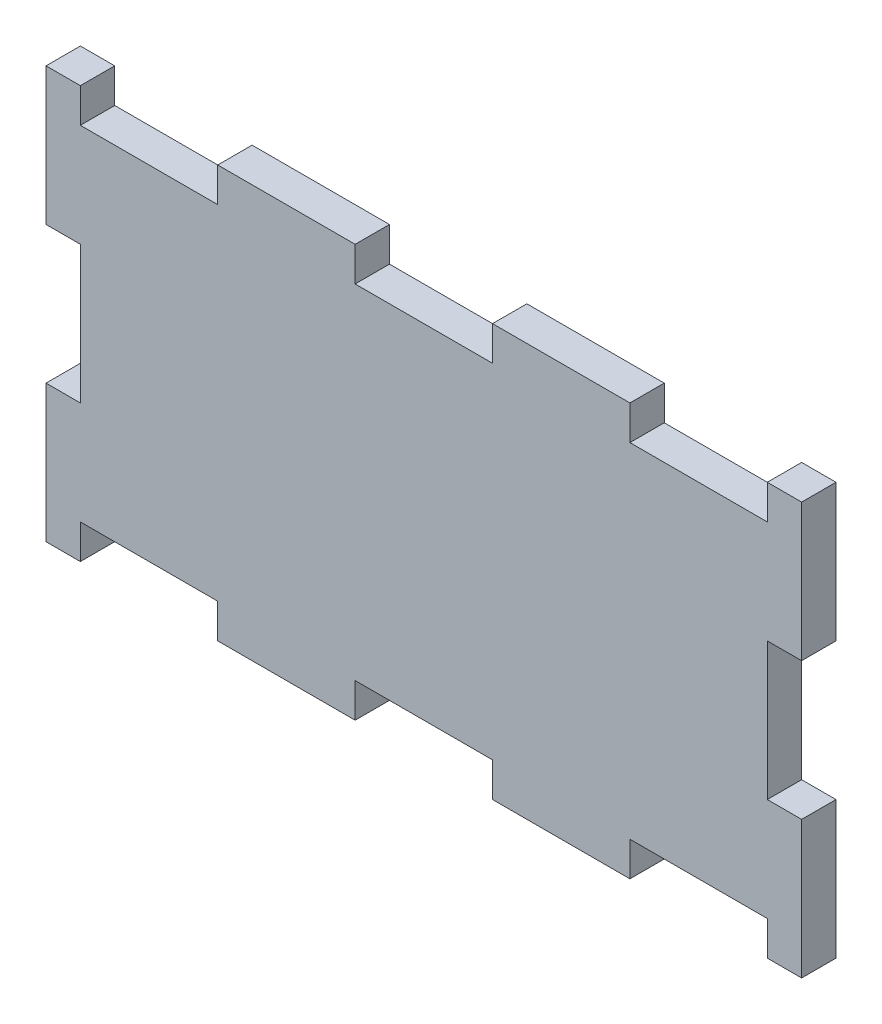
ISO-10303-21;
HEADER;
FILE_DESCRIPTION(('STEP AP214'),'2;1');
FILE_NAME('part.step','',(''),(''),'','','');
FILE_SCHEMA(('AUTOMOTIVE_DESIGN { 1 0 10303 214 1 1 1 1 }'));
ENDSEC;
DATA;
#1=APPLICATION_CONTEXT('core data for automotive mechanical design processes');
#2=APPLICATION_PROTOCOL_DEFINITION('international standard','automotive_design',2000,#1);
#3=PRODUCT_CONTEXT('',#1,'mechanical');
#4=PRODUCT('Part','Part','',(#3));
#5=PRODUCT_RELATED_PRODUCT_CATEGORY('part','',(#4));
#6=PRODUCT_DEFINITION_FORMATION('','',#4);
#7=PRODUCT_DEFINITION_CONTEXT('part definition',#1,'design');
#8=PRODUCT_DEFINITION('design','',#6,#7);
#9=PRODUCT_DEFINITION_SHAPE('','',#8);
#10=(LENGTH_UNIT() NAMED_UNIT(*) SI_UNIT(.MILLI.,.METRE.));
#11=(NAMED_UNIT(*) PLANE_ANGLE_UNIT() SI_UNIT($,.RADIAN.));
#12=(NAMED_UNIT(*) SI_UNIT($,.STERADIAN.) SOLID_ANGLE_UNIT());
#13=UNCERTAINTY_MEASURE_WITH_UNIT(LENGTH_MEASURE(1.E-05),#10,'distance_accuracy_value','');
#14=(GEOMETRIC_REPRESENTATION_CONTEXT(3) GLOBAL_UNCERTAINTY_ASSIGNED_CONTEXT((#13)) GLOBAL_UNIT_ASSIGNED_CONTEXT((#10,
#11,#12)) REPRESENTATION_CONTEXT('',''));
#15=CARTESIAN_POINT('',(0.,0.,0.));
#16=DIRECTION('',(0.,0.,1.));
#17=DIRECTION('',(1.,0.,0.));
#18=AXIS2_PLACEMENT_3D('',#15,#16,#17);
#19=CARTESIAN_POINT('',(-50.,25.,5.));
#20=DIRECTION('',(1.,0.,0.));
#21=DIRECTION('',(0.,0.,-1.));
#22=AXIS2_PLACEMENT_3D('',#19,#20,#21);
#23=PLANE('',#22);
#24=DIRECTION('',(0.,0.,1.));
#25=VECTOR('',#24,1.);
#26=CARTESIAN_POINT('',(-50.,10.,-20.6155281280883));
#27=LINE('',#26,#25);
#28=CARTESIAN_POINT('',(-50.,10.,0.));
#29=VERTEX_POINT('',#28);
#30=CARTESIAN_POINT('',(-50.,10.,5.));
#31=VERTEX_POINT('',#30);
#32=EDGE_CURVE('E348',#29,#31,#27,.T.);
#33=ORIENTED_EDGE('',*,*,#32,.F.);
#34=DIRECTION('',(0.,-1.,0.));
#35=VECTOR('',#34,1.);
#36=CARTESIAN_POINT('',(-50.,25.,0.));
#37=LINE('',#36,#35);
#38=CARTESIAN_POINT('',(-50.,-10.,0.));
#39=VERTEX_POINT('',#38);
#40=EDGE_CURVE('E615',#29,#39,#37,.T.);
#41=ORIENTED_EDGE('',*,*,#40,.T.);
#42=DIRECTION('',(0.,0.,1.));
#43=VECTOR('',#42,1.);
#44=CARTESIAN_POINT('',(-50.,-10.,-20.6155281280883));
#45=LINE('',#44,#43);
#46=CARTESIAN_POINT('',(-50.,-10.,5.));
#47=VERTEX_POINT('',#46);
#48=EDGE_CURVE('E534',#39,#47,#45,.T.);
#49=ORIENTED_EDGE('',*,*,#48,.T.);
#50=DIRECTION('',(0.,-1.,0.));
#51=VECTOR('',#50,1.);
#52=CARTESIAN_POINT('',(-50.,25.,5.));
#53=LINE('',#52,#51);
#54=EDGE_CURVE('E599',#31,#47,#53,.T.);
#55=ORIENTED_EDGE('',*,*,#54,.F.);
#56=EDGE_LOOP('',(#33,#41,#49,#55));
#57=FACE_BOUND('',#56,.T.);
#58=ADVANCED_FACE('F39',(#57),#23,.F.);
#59=CARTESIAN_POINT('',(-50.,-25.,5.));
#60=DIRECTION('',(0.,1.,0.));
#61=DIRECTION('',(0.,0.,1.));
#62=AXIS2_PLACEMENT_3D('',#59,#60,#61);
#63=PLANE('',#62);
#64=DIRECTION('',(0.,0.,1.));
#65=VECTOR('',#64,1.);
#66=CARTESIAN_POINT('',(30.,-25.,-20.6155281280883));
#67=LINE('',#66,#65);
#68=CARTESIAN_POINT('',(30.,-25.,0.));
#69=VERTEX_POINT('',#68);
#70=CARTESIAN_POINT('',(30.,-25.,5.));
#71=VERTEX_POINT('',#70);
#72=EDGE_CURVE('E388',#69,#71,#67,.T.);
#73=ORIENTED_EDGE('',*,*,#72,.F.);
#74=DIRECTION('',(1.,0.,0.));
#75=VECTOR('',#74,1.);
#76=CARTESIAN_POINT('',(-50.,-25.,0.));
#77=LINE('',#76,#75);
#78=CARTESIAN_POINT('',(50.,-25.,0.));
#79=VERTEX_POINT('',#78);
#80=EDGE_CURVE('E619',#69,#79,#77,.T.);
#81=ORIENTED_EDGE('',*,*,#80,.T.);
#82=DIRECTION('',(0.,0.,-1.));
#83=VECTOR('',#82,1.);
#84=CARTESIAN_POINT('',(50.,-25.,5.));
#85=LINE('',#84,#83);
#86=CARTESIAN_POINT('',(50.,-25.,5.));
#87=VERTEX_POINT('',#86);
#88=EDGE_CURVE('E607',#87,#79,#85,.T.);
#89=ORIENTED_EDGE('',*,*,#88,.F.);
#90=DIRECTION('',(1.,0.,0.));
#91=VECTOR('',#90,1.);
#92=CARTESIAN_POINT('',(-50.,-25.,5.));
#93=LINE('',#92,#91);
#94=EDGE_CURVE('E603',#71,#87,#93,.T.);
#95=ORIENTED_EDGE('',*,*,#94,.F.);
#96=EDGE_LOOP('',(#73,#81,#89,#95));
#97=FACE_BOUND('',#96,.T.);
#98=ADVANCED_FACE('F724',(#97),#63,.F.);
#99=DIRECTION('',(0.,0.,1.));
#100=VECTOR('',#99,1.);
#101=CARTESIAN_POINT('',(10.,-25.,-20.6155281280883));
#102=LINE('',#101,#100);
#103=CARTESIAN_POINT('',(10.,-25.,0.));
#104=VERTEX_POINT('',#103);
#105=CARTESIAN_POINT('',(10.,-25.,5.));
#106=VERTEX_POINT('',#105);
#107=EDGE_CURVE('E385',#104,#106,#102,.T.);
#108=ORIENTED_EDGE('',*,*,#107,.T.);
#109=CARTESIAN_POINT('',(-10.,-25.,5.));
#110=VERTEX_POINT('',#109);
#111=EDGE_CURVE('E608',#110,#106,#93,.T.);
#112=ORIENTED_EDGE('',*,*,#111,.F.);
#113=DIRECTION('',(0.,0.,1.));
#114=VECTOR('',#113,1.);
#115=CARTESIAN_POINT('',(-10.,-25.,-20.6155281280883));
#116=LINE('',#115,#114);
#117=CARTESIAN_POINT('',(-10.,-25.,0.));
#118=VERTEX_POINT('',#117);
#119=EDGE_CURVE('E423',#118,#110,#116,.T.);
#120=ORIENTED_EDGE('',*,*,#119,.F.);
#121=EDGE_CURVE('E622',#118,#104,#77,.T.);
#122=ORIENTED_EDGE('',*,*,#121,.T.);
#123=EDGE_LOOP('',(#108,#112,#120,#122));
#124=FACE_BOUND('',#123,.T.);
#125=ADVANCED_FACE('F730',(#124),#63,.F.);
#126=CARTESIAN_POINT('',(-50.,25.,5.));
#127=DIRECTION('',(0.,-1.,0.));
#128=DIRECTION('',(0.,0.,-1.));
#129=AXIS2_PLACEMENT_3D('',#126,#127,#128);
#130=PLANE('',#129);
#131=DIRECTION('',(0.,0.,1.));
#132=VECTOR('',#131,1.);
#133=CARTESIAN_POINT('',(-30.,25.,-20.6155281280883));
#134=LINE('',#133,#132);
#135=CARTESIAN_POINT('',(-30.,25.,0.));
#136=VERTEX_POINT('',#135);
#137=CARTESIAN_POINT('',(-30.,25.,5.));
#138=VERTEX_POINT('',#137);
#139=EDGE_CURVE('E460',#136,#138,#134,.T.);
#140=ORIENTED_EDGE('',*,*,#139,.F.);
#141=DIRECTION('',(-1.,0.,0.));
#142=VECTOR('',#141,1.);
#143=CARTESIAN_POINT('',(-50.,25.,0.));
#144=LINE('',#143,#142);
#145=CARTESIAN_POINT('',(-50.,25.,0.));
#146=VERTEX_POINT('',#145);
#147=EDGE_CURVE('E611',#136,#146,#144,.T.);
#148=ORIENTED_EDGE('',*,*,#147,.T.);
#149=DIRECTION('',(0.,0.,-1.));
#150=VECTOR('',#149,1.);
#151=CARTESIAN_POINT('',(-50.,25.,5.));
#152=LINE('',#151,#150);
#153=CARTESIAN_POINT('',(-50.,25.,5.));
#154=VERTEX_POINT('',#153);
#155=EDGE_CURVE('E48',#154,#146,#152,.T.);
#156=ORIENTED_EDGE('',*,*,#155,.F.);
#157=DIRECTION('',(-1.,0.,0.));
#158=VECTOR('',#157,1.);
#159=CARTESIAN_POINT('',(-50.,25.,5.));
#160=LINE('',#159,#158);
#161=EDGE_CURVE('E593',#138,#154,#160,.T.);
#162=ORIENTED_EDGE('',*,*,#161,.F.);
#163=EDGE_LOOP('',(#140,#148,#156,#162));
#164=FACE_BOUND('',#163,.T.);
#165=ADVANCED_FACE('F665',(#164),#130,.F.);
#166=DIRECTION('',(0.,0.,1.));
#167=VECTOR('',#166,1.);
#168=CARTESIAN_POINT('',(-10.,25.,-20.6155281280883));
#169=LINE('',#168,#167);
#170=CARTESIAN_POINT('',(-10.,25.,0.));
#171=VERTEX_POINT('',#170);
#172=CARTESIAN_POINT('',(-10.,25.,5.));
#173=VERTEX_POINT('',#172);
#174=EDGE_CURVE('E457',#171,#173,#169,.T.);
#175=ORIENTED_EDGE('',*,*,#174,.T.);
#176=CARTESIAN_POINT('',(10.,25.,5.));
#177=VERTEX_POINT('',#176);
#178=EDGE_CURVE('E600',#177,#173,#160,.T.);
#179=ORIENTED_EDGE('',*,*,#178,.F.);
#180=DIRECTION('',(0.,0.,1.));
#181=VECTOR('',#180,1.);
#182=CARTESIAN_POINT('',(10.,25.,-20.6155281280883));
#183=LINE('',#182,#181);
#184=CARTESIAN_POINT('',(10.,25.,0.));
#185=VERTEX_POINT('',#184);
#186=EDGE_CURVE('E495',#185,#177,#183,.T.);
#187=ORIENTED_EDGE('',*,*,#186,.F.);
#188=EDGE_CURVE('E616',#185,#171,#144,.T.);
#189=ORIENTED_EDGE('',*,*,#188,.T.);
#190=EDGE_LOOP('',(#175,#179,#187,#189));
#191=FACE_BOUND('',#190,.T.);
#192=ADVANCED_FACE('F669',(#191),#130,.F.);
#193=CARTESIAN_POINT('',(50.,25.,5.));
#194=DIRECTION('',(-1.,0.,0.));
#195=DIRECTION('',(0.,0.,1.));
#196=AXIS2_PLACEMENT_3D('',#193,#194,#195);
#197=PLANE('',#196);
#198=DIRECTION('',(0.,1.,0.));
#199=VECTOR('',#198,1.);
#200=CARTESIAN_POINT('',(50.,25.,0.));
#201=LINE('',#200,#199);
#202=CARTESIAN_POINT('',(50.,-10.,0.));
#203=VERTEX_POINT('',#202);
#204=CARTESIAN_POINT('',(50.,10.,0.));
#205=VERTEX_POINT('',#204);
#206=EDGE_CURVE('E60',#203,#205,#201,.T.);
#207=ORIENTED_EDGE('',*,*,#206,.T.);
#208=DIRECTION('',(0.,0.,1.));
#209=VECTOR('',#208,1.);
#210=CARTESIAN_POINT('',(50.,10.,-20.6155281280883));
#211=LINE('',#210,#209);
#212=CARTESIAN_POINT('',(50.,10.,5.));
#213=VERTEX_POINT('',#212);
#214=EDGE_CURVE('E55',#205,#213,#211,.T.);
#215=ORIENTED_EDGE('',*,*,#214,.T.);
#216=DIRECTION('',(0.,1.,0.));
#217=VECTOR('',#216,1.);
#218=CARTESIAN_POINT('',(50.,25.,5.));
#219=LINE('',#218,#217);
#220=CARTESIAN_POINT('',(50.,-10.,5.));
#221=VERTEX_POINT('',#220);
#222=EDGE_CURVE('E296',#221,#213,#219,.T.);
#223=ORIENTED_EDGE('',*,*,#222,.F.);
#224=DIRECTION('',(0.,0.,1.));
#225=VECTOR('',#224,1.);
#226=CARTESIAN_POINT('',(50.,-10.,-20.6155281280883));
#227=LINE('',#226,#225);
#228=EDGE_CURVE('E555',#203,#221,#227,.T.);
#229=ORIENTED_EDGE('',*,*,#228,.F.);
#230=EDGE_LOOP('',(#207,#215,#223,#229));
#231=FACE_BOUND('',#230,.T.);
#232=ADVANCED_FACE('F41',(#231),#197,.F.);
#233=CARTESIAN_POINT('',(50.,25.,0.));
#234=VERTEX_POINT('',#233);
#235=CARTESIAN_POINT('',(30.,25.,0.));
#236=VERTEX_POINT('',#235);
#237=EDGE_CURVE('E612',#234,#236,#144,.T.);
#238=ORIENTED_EDGE('',*,*,#237,.T.);
#239=DIRECTION('',(0.,0.,1.));
#240=VECTOR('',#239,1.);
#241=CARTESIAN_POINT('',(30.,25.,-20.6155281280883));
#242=LINE('',#241,#240);
#243=CARTESIAN_POINT('',(30.,25.,5.));
#244=VERTEX_POINT('',#243);
#245=EDGE_CURVE('E501',#236,#244,#242,.T.);
#246=ORIENTED_EDGE('',*,*,#245,.T.);
#247=CARTESIAN_POINT('',(50.,25.,5.));
#248=VERTEX_POINT('',#247);
#249=EDGE_CURVE('E595',#248,#244,#160,.T.);
#250=ORIENTED_EDGE('',*,*,#249,.F.);
#251=DIRECTION('',(0.,0.,-1.));
#252=VECTOR('',#251,1.);
#253=CARTESIAN_POINT('',(50.,25.,5.));
#254=LINE('',#253,#252);
#255=EDGE_CURVE('E11',#248,#234,#254,.T.);
#256=ORIENTED_EDGE('',*,*,#255,.T.);
#257=EDGE_LOOP('',(#238,#246,#250,#256));
#258=FACE_BOUND('',#257,.T.);
#259=ADVANCED_FACE('F686',(#258),#130,.F.);
#260=CARTESIAN_POINT('',(-50.,-25.,0.));
#261=VERTEX_POINT('',#260);
#262=CARTESIAN_POINT('',(-30.,-25.,0.));
#263=VERTEX_POINT('',#262);
#264=EDGE_CURVE('E594',#261,#263,#77,.T.);
#265=ORIENTED_EDGE('',*,*,#264,.T.);
#266=DIRECTION('',(0.,0.,1.));
#267=VECTOR('',#266,1.);
#268=CARTESIAN_POINT('',(-30.,-25.,-20.6155281280883));
#269=LINE('',#268,#267);
#270=CARTESIAN_POINT('',(-30.,-25.,5.));
#271=VERTEX_POINT('',#270);
#272=EDGE_CURVE('E429',#263,#271,#269,.T.);
#273=ORIENTED_EDGE('',*,*,#272,.T.);
#274=CARTESIAN_POINT('',(-50.,-25.,5.));
#275=VERTEX_POINT('',#274);
#276=EDGE_CURVE('E604',#275,#271,#93,.T.);
#277=ORIENTED_EDGE('',*,*,#276,.F.);
#278=DIRECTION('',(0.,0.,-1.));
#279=VECTOR('',#278,1.);
#280=CARTESIAN_POINT('',(-50.,-25.,5.));
#281=LINE('',#280,#279);
#282=EDGE_CURVE('E626',#275,#261,#281,.T.);
#283=ORIENTED_EDGE('',*,*,#282,.T.);
#284=EDGE_LOOP('',(#265,#273,#277,#283));
#285=FACE_BOUND('',#284,.T.);
#286=ADVANCED_FACE('F767',(#285),#63,.F.);
#287=CARTESIAN_POINT('',(0.,0.,5.));
#288=DIRECTION('',(0.,0.,1.));
#289=DIRECTION('',(1.,0.,0.));
#290=AXIS2_PLACEMENT_3D('',#287,#288,#289);
#291=PLANE('',#290);
#292=ORIENTED_EDGE('',*,*,#276,.T.);
#293=DIRECTION('',(0.,-1.,0.));
#294=VECTOR('',#293,1.);
#295=CARTESIAN_POINT('',(-30.,-25.,5.));
#296=LINE('',#295,#294);
#297=CARTESIAN_POINT('',(-30.,-30.,5.));
#298=VERTEX_POINT('',#297);
#299=EDGE_CURVE('E415',#271,#298,#296,.T.);
#300=ORIENTED_EDGE('',*,*,#299,.T.);
#301=DIRECTION('',(1.,0.,0.));
#302=VECTOR('',#301,1.);
#303=CARTESIAN_POINT('',(-10.,-30.,5.));
#304=LINE('',#303,#302);
#305=CARTESIAN_POINT('',(-10.,-30.,5.));
#306=VERTEX_POINT('',#305);
#307=EDGE_CURVE('E419',#298,#306,#304,.T.);
#308=ORIENTED_EDGE('',*,*,#307,.T.);
#309=DIRECTION('',(0.,1.,0.));
#310=VECTOR('',#309,1.);
#311=CARTESIAN_POINT('',(-10.,-25.,5.));
#312=LINE('',#311,#310);
#313=EDGE_CURVE('E372',#306,#110,#312,.T.);
#314=ORIENTED_EDGE('',*,*,#313,.T.);
#315=ORIENTED_EDGE('',*,*,#111,.T.);
#316=DIRECTION('',(0.,1.,0.));
#317=VECTOR('',#316,1.);
#318=CARTESIAN_POINT('',(10.,-25.,5.));
#319=LINE('',#318,#317);
#320=CARTESIAN_POINT('',(10.,-30.,5.));
#321=VERTEX_POINT('',#320);
#322=EDGE_CURVE('E331',#321,#106,#319,.T.);
#323=ORIENTED_EDGE('',*,*,#322,.F.);
#324=DIRECTION('',(-1.,0.,0.));
#325=VECTOR('',#324,1.);
#326=CARTESIAN_POINT('',(10.,-30.,5.));
#327=LINE('',#326,#325);
#328=CARTESIAN_POINT('',(30.,-30.,5.));
#329=VERTEX_POINT('',#328);
#330=EDGE_CURVE('E376',#329,#321,#327,.T.);
#331=ORIENTED_EDGE('',*,*,#330,.F.);
#332=DIRECTION('',(0.,-1.,0.));
#333=VECTOR('',#332,1.);
#334=CARTESIAN_POINT('',(30.,-25.,5.));
#335=LINE('',#334,#333);
#336=EDGE_CURVE('E380',#71,#329,#335,.T.);
#337=ORIENTED_EDGE('',*,*,#336,.F.);
#338=ORIENTED_EDGE('',*,*,#94,.T.);
#339=DIRECTION('',(0.,-1.,0.));
#340=VECTOR('',#339,1.);
#341=CARTESIAN_POINT('',(50.,-10.,5.));
#342=LINE('',#341,#340);
#343=CARTESIAN_POINT('',(50.,-30.,5.));
#344=VERTEX_POINT('',#343);
#345=EDGE_CURVE('E519',#87,#344,#342,.T.);
#346=ORIENTED_EDGE('',*,*,#345,.T.);
#347=DIRECTION('',(1.,0.,0.));
#348=VECTOR('',#347,1.);
#349=CARTESIAN_POINT('',(50.,-30.,5.));
#350=LINE('',#349,#348);
#351=CARTESIAN_POINT('',(55.,-30.,5.));
#352=VERTEX_POINT('',#351);
#353=EDGE_CURVE('E565',#344,#352,#350,.T.);
#354=ORIENTED_EDGE('',*,*,#353,.T.);
#355=DIRECTION('',(0.,1.,0.));
#356=VECTOR('',#355,1.);
#357=CARTESIAN_POINT('',(55.,-10.,5.));
#358=LINE('',#357,#356);
#359=CARTESIAN_POINT('',(55.,-10.,5.));
#360=VERTEX_POINT('',#359);
#361=EDGE_CURVE('E569',#352,#360,#358,.T.);
#362=ORIENTED_EDGE('',*,*,#361,.T.);
#363=DIRECTION('',(-1.,0.,0.));
#364=VECTOR('',#363,1.);
#365=CARTESIAN_POINT('',(50.,-10.,5.));
#366=LINE('',#365,#364);
#367=EDGE_CURVE('E573',#360,#221,#366,.T.);
#368=ORIENTED_EDGE('',*,*,#367,.T.);
#369=ORIENTED_EDGE('',*,*,#222,.T.);
#370=DIRECTION('',(1.,0.,0.));
#371=VECTOR('',#370,1.);
#372=CARTESIAN_POINT('',(50.,10.,5.));
#373=LINE('',#372,#371);
#374=CARTESIAN_POINT('',(55.,10.,5.));
#375=VERTEX_POINT('',#374);
#376=EDGE_CURVE('E276',#213,#375,#373,.T.);
#377=ORIENTED_EDGE('',*,*,#376,.T.);
#378=DIRECTION('',(0.,1.,0.));
#379=VECTOR('',#378,1.);
#380=CARTESIAN_POINT('',(55.,30.,5.));
#381=LINE('',#380,#379);
#382=CARTESIAN_POINT('',(55.,30.,5.));
#383=VERTEX_POINT('',#382);
#384=EDGE_CURVE('E284',#375,#383,#381,.T.);
#385=ORIENTED_EDGE('',*,*,#384,.T.);
#386=DIRECTION('',(-1.,0.,0.));
#387=VECTOR('',#386,1.);
#388=CARTESIAN_POINT('',(50.,30.,5.));
#389=LINE('',#388,#387);
#390=CARTESIAN_POINT('',(50.,30.,5.));
#391=VERTEX_POINT('',#390);
#392=EDGE_CURVE('E291',#383,#391,#389,.T.);
#393=ORIENTED_EDGE('',*,*,#392,.T.);
#394=DIRECTION('',(0.,-1.,0.));
#395=VECTOR('',#394,1.);
#396=CARTESIAN_POINT('',(50.,30.,5.));
#397=LINE('',#396,#395);
#398=EDGE_CURVE('E298',#391,#248,#397,.T.);
#399=ORIENTED_EDGE('',*,*,#398,.T.);
#400=ORIENTED_EDGE('',*,*,#249,.T.);
#401=DIRECTION('',(0.,1.,0.));
#402=VECTOR('',#401,1.);
#403=CARTESIAN_POINT('',(30.,25.,5.));
#404=LINE('',#403,#402);
#405=CARTESIAN_POINT('',(30.,30.,5.));
#406=VERTEX_POINT('',#405);
#407=EDGE_CURVE('E487',#244,#406,#404,.T.);
#408=ORIENTED_EDGE('',*,*,#407,.T.);
#409=DIRECTION('',(-1.,0.,0.));
#410=VECTOR('',#409,1.);
#411=CARTESIAN_POINT('',(10.,30.,5.));
#412=LINE('',#411,#410);
#413=CARTESIAN_POINT('',(10.,30.,5.));
#414=VERTEX_POINT('',#413);
#415=EDGE_CURVE('E491',#406,#414,#412,.T.);
#416=ORIENTED_EDGE('',*,*,#415,.T.);
#417=DIRECTION('',(0.,-1.,0.));
#418=VECTOR('',#417,1.);
#419=CARTESIAN_POINT('',(10.,25.,5.));
#420=LINE('',#419,#418);
#421=EDGE_CURVE('E444',#414,#177,#420,.T.);
#422=ORIENTED_EDGE('',*,*,#421,.T.);
#423=ORIENTED_EDGE('',*,*,#178,.T.);
#424=DIRECTION('',(0.,-1.,0.));
#425=VECTOR('',#424,1.);
#426=CARTESIAN_POINT('',(-10.,25.,5.));
#427=LINE('',#426,#425);
#428=CARTESIAN_POINT('',(-10.,30.,5.));
#429=VERTEX_POINT('',#428);
#430=EDGE_CURVE('E411',#429,#173,#427,.T.);
#431=ORIENTED_EDGE('',*,*,#430,.F.);
#432=DIRECTION('',(1.,0.,0.));
#433=VECTOR('',#432,1.);
#434=CARTESIAN_POINT('',(-10.,30.,5.));
#435=LINE('',#434,#433);
#436=CARTESIAN_POINT('',(-30.,30.,5.));
#437=VERTEX_POINT('',#436);
#438=EDGE_CURVE('E448',#437,#429,#435,.T.);
#439=ORIENTED_EDGE('',*,*,#438,.F.);
#440=DIRECTION('',(0.,1.,0.));
#441=VECTOR('',#440,1.);
#442=CARTESIAN_POINT('',(-30.,25.,5.));
#443=LINE('',#442,#441);
#444=EDGE_CURVE('E452',#138,#437,#443,.T.);
#445=ORIENTED_EDGE('',*,*,#444,.F.);
#446=ORIENTED_EDGE('',*,*,#161,.T.);
#447=DIRECTION('',(0.,-1.,0.));
#448=VECTOR('',#447,1.);
#449=CARTESIAN_POINT('',(-50.,30.,5.));
#450=LINE('',#449,#448);
#451=CARTESIAN_POINT('',(-50.,30.,5.));
#452=VERTEX_POINT('',#451);
#453=EDGE_CURVE('E317',#452,#154,#450,.T.);
#454=ORIENTED_EDGE('',*,*,#453,.F.);
#455=DIRECTION('',(1.,0.,0.));
#456=VECTOR('',#455,1.);
#457=CARTESIAN_POINT('',(-50.,30.,5.));
#458=LINE('',#457,#456);
#459=CARTESIAN_POINT('',(-55.,30.,5.));
#460=VERTEX_POINT('',#459);
#461=EDGE_CURVE('E335',#460,#452,#458,.T.);
#462=ORIENTED_EDGE('',*,*,#461,.F.);
#463=DIRECTION('',(0.,1.,0.));
#464=VECTOR('',#463,1.);
#465=CARTESIAN_POINT('',(-55.,30.,5.));
#466=LINE('',#465,#464);
#467=CARTESIAN_POINT('',(-55.,10.,5.));
#468=VERTEX_POINT('',#467);
#469=EDGE_CURVE('E339',#468,#460,#466,.T.);
#470=ORIENTED_EDGE('',*,*,#469,.F.);
#471=DIRECTION('',(-1.,0.,0.));
#472=VECTOR('',#471,1.);
#473=CARTESIAN_POINT('',(-50.,10.,5.));
#474=LINE('',#473,#472);
#475=EDGE_CURVE('E343',#31,#468,#474,.T.);
#476=ORIENTED_EDGE('',*,*,#475,.F.);
#477=ORIENTED_EDGE('',*,*,#54,.T.);
#478=DIRECTION('',(1.,0.,0.));
#479=VECTOR('',#478,1.);
#480=CARTESIAN_POINT('',(-50.,-10.,5.));
#481=LINE('',#480,#479);
#482=CARTESIAN_POINT('',(-55.,-10.,5.));
#483=VERTEX_POINT('',#482);
#484=EDGE_CURVE('E522',#483,#47,#481,.T.);
#485=ORIENTED_EDGE('',*,*,#484,.F.);
#486=DIRECTION('',(0.,1.,0.));
#487=VECTOR('',#486,1.);
#488=CARTESIAN_POINT('',(-55.,-10.,5.));
#489=LINE('',#488,#487);
#490=CARTESIAN_POINT('',(-55.,-30.,5.));
#491=VERTEX_POINT('',#490);
#492=EDGE_CURVE('E526',#491,#483,#489,.T.);
#493=ORIENTED_EDGE('',*,*,#492,.F.);
#494=DIRECTION('',(-1.,0.,0.));
#495=VECTOR('',#494,1.);
#496=CARTESIAN_POINT('',(-50.,-30.,5.));
#497=LINE('',#496,#495);
#498=CARTESIAN_POINT('',(-50.,-30.,5.));
#499=VERTEX_POINT('',#498);
#500=EDGE_CURVE('E530',#499,#491,#497,.T.);
#501=ORIENTED_EDGE('',*,*,#500,.F.);
#502=DIRECTION('',(0.,-1.,0.));
#503=VECTOR('',#502,1.);
#504=CARTESIAN_POINT('',(-50.,-10.,5.));
#505=LINE('',#504,#503);
#506=EDGE_CURVE('E483',#275,#499,#505,.T.);
#507=ORIENTED_EDGE('',*,*,#506,.F.);
#508=EDGE_LOOP('',(#292,#300,#308,#314,#315,#323,#331,#337,#338,#346,#354,#362,#368,#369,#377,
#385,#393,#399,#400,#408,#416,#422,#423,#431,#439,#445,#446,#454,#462,#470,#476,#477,#485,#493,
#501,#507));
#509=FACE_BOUND('',#508,.T.);
#510=ADVANCED_FACE('F294',(#509),#291,.T.);
#511=CARTESIAN_POINT('',(0.,0.,0.));
#512=DIRECTION('',(0.,0.,1.));
#513=DIRECTION('',(1.,0.,0.));
#514=AXIS2_PLACEMENT_3D('',#511,#512,#513);
#515=PLANE('',#514);
#516=ORIENTED_EDGE('',*,*,#206,.F.);
#517=DIRECTION('',(1.,0.,0.));
#518=VECTOR('',#517,1.);
#519=CARTESIAN_POINT('',(50.,-10.,0.));
#520=LINE('',#519,#518);
#521=CARTESIAN_POINT('',(55.,-10.,0.));
#522=VERTEX_POINT('',#521);
#523=EDGE_CURVE('E554',#203,#522,#520,.T.);
#524=ORIENTED_EDGE('',*,*,#523,.T.);
#525=DIRECTION('',(0.,-1.,0.));
#526=VECTOR('',#525,1.);
#527=CARTESIAN_POINT('',(55.,-10.,0.));
#528=LINE('',#527,#526);
#529=CARTESIAN_POINT('',(55.,-30.,0.));
#530=VERTEX_POINT('',#529);
#531=EDGE_CURVE('E551',#522,#530,#528,.T.);
#532=ORIENTED_EDGE('',*,*,#531,.T.);
#533=DIRECTION('',(-1.,0.,0.));
#534=VECTOR('',#533,1.);
#535=CARTESIAN_POINT('',(50.,-30.,0.));
#536=LINE('',#535,#534);
#537=CARTESIAN_POINT('',(50.,-30.,0.));
#538=VERTEX_POINT('',#537);
#539=EDGE_CURVE('E562',#530,#538,#536,.T.);
#540=ORIENTED_EDGE('',*,*,#539,.T.);
#541=DIRECTION('',(0.,1.,0.));
#542=VECTOR('',#541,1.);
#543=CARTESIAN_POINT('',(50.,-10.,0.));
#544=LINE('',#543,#542);
#545=EDGE_CURVE('E558',#538,#79,#544,.T.);
#546=ORIENTED_EDGE('',*,*,#545,.T.);
#547=ORIENTED_EDGE('',*,*,#80,.F.);
#548=DIRECTION('',(0.,1.,0.));
#549=VECTOR('',#548,1.);
#550=CARTESIAN_POINT('',(30.,-25.,0.));
#551=LINE('',#550,#549);
#552=CARTESIAN_POINT('',(30.,-30.,0.));
#553=VERTEX_POINT('',#552);
#554=EDGE_CURVE('E363',#553,#69,#551,.T.);
#555=ORIENTED_EDGE('',*,*,#554,.F.);
#556=DIRECTION('',(1.,0.,0.));
#557=VECTOR('',#556,1.);
#558=CARTESIAN_POINT('',(10.,-30.,0.));
#559=LINE('',#558,#557);
#560=CARTESIAN_POINT('',(10.,-30.,0.));
#561=VERTEX_POINT('',#560);
#562=EDGE_CURVE('E368',#561,#553,#559,.T.);
#563=ORIENTED_EDGE('',*,*,#562,.F.);
#564=DIRECTION('',(0.,-1.,0.));
#565=VECTOR('',#564,1.);
#566=CARTESIAN_POINT('',(10.,-25.,0.));
#567=LINE('',#566,#565);
#568=EDGE_CURVE('E367',#104,#561,#567,.T.);
#569=ORIENTED_EDGE('',*,*,#568,.F.);
#570=ORIENTED_EDGE('',*,*,#121,.F.);
#571=DIRECTION('',(0.,-1.,0.));
#572=VECTOR('',#571,1.);
#573=CARTESIAN_POINT('',(-10.,-25.,0.));
#574=LINE('',#573,#572);
#575=CARTESIAN_POINT('',(-10.,-30.,0.));
#576=VERTEX_POINT('',#575);
#577=EDGE_CURVE('E408',#118,#576,#574,.T.);
#578=ORIENTED_EDGE('',*,*,#577,.T.);
#579=DIRECTION('',(-1.,0.,0.));
#580=VECTOR('',#579,1.);
#581=CARTESIAN_POINT('',(-10.,-30.,0.));
#582=LINE('',#581,#580);
#583=CARTESIAN_POINT('',(-30.,-30.,0.));
#584=VERTEX_POINT('',#583);
#585=EDGE_CURVE('E404',#576,#584,#582,.T.);
#586=ORIENTED_EDGE('',*,*,#585,.T.);
#587=DIRECTION('',(0.,1.,0.));
#588=VECTOR('',#587,1.);
#589=CARTESIAN_POINT('',(-30.,-25.,0.));
#590=LINE('',#589,#588);
#591=EDGE_CURVE('E400',#584,#263,#590,.T.);
#592=ORIENTED_EDGE('',*,*,#591,.T.);
#593=ORIENTED_EDGE('',*,*,#264,.F.);
#594=DIRECTION('',(0.,1.,0.));
#595=VECTOR('',#594,1.);
#596=CARTESIAN_POINT('',(-50.,-10.,0.));
#597=LINE('',#596,#595);
#598=CARTESIAN_POINT('',(-50.,-30.,0.));
#599=VERTEX_POINT('',#598);
#600=EDGE_CURVE('E516',#599,#261,#597,.T.);
#601=ORIENTED_EDGE('',*,*,#600,.F.);
#602=DIRECTION('',(1.,0.,0.));
#603=VECTOR('',#602,1.);
#604=CARTESIAN_POINT('',(-50.,-30.,0.));
#605=LINE('',#604,#603);
#606=CARTESIAN_POINT('',(-55.,-30.,0.));
#607=VERTEX_POINT('',#606);
#608=EDGE_CURVE('E511',#607,#599,#605,.T.);
#609=ORIENTED_EDGE('',*,*,#608,.F.);
#610=DIRECTION('',(0.,-1.,0.));
#611=VECTOR('',#610,1.);
#612=CARTESIAN_POINT('',(-55.,-10.,0.));
#613=LINE('',#612,#611);
#614=CARTESIAN_POINT('',(-55.,-10.,0.));
#615=VERTEX_POINT('',#614);
#616=EDGE_CURVE('E507',#615,#607,#613,.T.);
#617=ORIENTED_EDGE('',*,*,#616,.F.);
#618=DIRECTION('',(-1.,0.,0.));
#619=VECTOR('',#618,1.);
#620=CARTESIAN_POINT('',(-50.,-10.,0.));
#621=LINE('',#620,#619);
#622=EDGE_CURVE('E512',#39,#615,#621,.T.);
#623=ORIENTED_EDGE('',*,*,#622,.F.);
#624=ORIENTED_EDGE('',*,*,#40,.F.);
#625=DIRECTION('',(1.,0.,0.));
#626=VECTOR('',#625,1.);
#627=CARTESIAN_POINT('',(-50.,10.,0.));
#628=LINE('',#627,#626);
#629=CARTESIAN_POINT('',(-55.,10.,0.));
#630=VERTEX_POINT('',#629);
#631=EDGE_CURVE('E323',#630,#29,#628,.T.);
#632=ORIENTED_EDGE('',*,*,#631,.F.);
#633=DIRECTION('',(0.,-1.,0.));
#634=VECTOR('',#633,1.);
#635=CARTESIAN_POINT('',(-55.,30.,0.));
#636=LINE('',#635,#634);
#637=CARTESIAN_POINT('',(-55.,30.,0.));
#638=VERTEX_POINT('',#637);
#639=EDGE_CURVE('E319',#638,#630,#636,.T.);
#640=ORIENTED_EDGE('',*,*,#639,.F.);
#641=DIRECTION('',(-1.,0.,0.));
#642=VECTOR('',#641,1.);
#643=CARTESIAN_POINT('',(-50.,30.,0.));
#644=LINE('',#643,#642);
#645=CARTESIAN_POINT('',(-50.,30.,0.));
#646=VERTEX_POINT('',#645);
#647=EDGE_CURVE('E324',#646,#638,#644,.T.);
#648=ORIENTED_EDGE('',*,*,#647,.F.);
#649=DIRECTION('',(0.,1.,0.));
#650=VECTOR('',#649,1.);
#651=CARTESIAN_POINT('',(-50.,30.,0.));
#652=LINE('',#651,#650);
#653=EDGE_CURVE('E328',#146,#646,#652,.T.);
#654=ORIENTED_EDGE('',*,*,#653,.F.);
#655=ORIENTED_EDGE('',*,*,#147,.F.);
#656=DIRECTION('',(0.,-1.,0.));
#657=VECTOR('',#656,1.);
#658=CARTESIAN_POINT('',(-30.,25.,0.));
#659=LINE('',#658,#657);
#660=CARTESIAN_POINT('',(-30.,30.,0.));
#661=VERTEX_POINT('',#660);
#662=EDGE_CURVE('E435',#661,#136,#659,.T.);
#663=ORIENTED_EDGE('',*,*,#662,.F.);
#664=DIRECTION('',(-1.,0.,0.));
#665=VECTOR('',#664,1.);
#666=CARTESIAN_POINT('',(-10.,30.,0.));
#667=LINE('',#666,#665);
#668=CARTESIAN_POINT('',(-10.,30.,0.));
#669=VERTEX_POINT('',#668);
#670=EDGE_CURVE('E440',#669,#661,#667,.T.);
#671=ORIENTED_EDGE('',*,*,#670,.F.);
#672=DIRECTION('',(0.,1.,0.));
#673=VECTOR('',#672,1.);
#674=CARTESIAN_POINT('',(-10.,25.,0.));
#675=LINE('',#674,#673);
#676=EDGE_CURVE('E439',#171,#669,#675,.T.);
#677=ORIENTED_EDGE('',*,*,#676,.F.);
#678=ORIENTED_EDGE('',*,*,#188,.F.);
#679=DIRECTION('',(0.,1.,0.));
#680=VECTOR('',#679,1.);
#681=CARTESIAN_POINT('',(10.,25.,0.));
#682=LINE('',#681,#680);
#683=CARTESIAN_POINT('',(10.,30.,0.));
#684=VERTEX_POINT('',#683);
#685=EDGE_CURVE('E480',#185,#684,#682,.T.);
#686=ORIENTED_EDGE('',*,*,#685,.T.);
#687=DIRECTION('',(1.,0.,0.));
#688=VECTOR('',#687,1.);
#689=CARTESIAN_POINT('',(10.,30.,0.));
#690=LINE('',#689,#688);
#691=CARTESIAN_POINT('',(30.,30.,0.));
#692=VERTEX_POINT('',#691);
#693=EDGE_CURVE('E476',#684,#692,#690,.T.);
#694=ORIENTED_EDGE('',*,*,#693,.T.);
#695=DIRECTION('',(0.,-1.,0.));
#696=VECTOR('',#695,1.);
#697=CARTESIAN_POINT('',(30.,25.,0.));
#698=LINE('',#697,#696);
#699=EDGE_CURVE('E472',#692,#236,#698,.T.);
#700=ORIENTED_EDGE('',*,*,#699,.T.);
#701=ORIENTED_EDGE('',*,*,#237,.F.);
#702=DIRECTION('',(0.,1.,0.));
#703=VECTOR('',#702,1.);
#704=CARTESIAN_POINT('',(50.,30.,0.));
#705=LINE('',#704,#703);
#706=CARTESIAN_POINT('',(50.,30.,0.));
#707=VERTEX_POINT('',#706);
#708=EDGE_CURVE('E318',#234,#707,#705,.T.);
#709=ORIENTED_EDGE('',*,*,#708,.T.);
#710=DIRECTION('',(1.,0.,0.));
#711=VECTOR('',#710,1.);
#712=CARTESIAN_POINT('',(50.,30.,0.));
#713=LINE('',#712,#711);
#714=CARTESIAN_POINT('',(55.,30.,0.));
#715=VERTEX_POINT('',#714);
#716=EDGE_CURVE('E694',#707,#715,#713,.T.);
#717=ORIENTED_EDGE('',*,*,#716,.T.);
#718=DIRECTION('',(0.,-1.,0.));
#719=VECTOR('',#718,1.);
#720=CARTESIAN_POINT('',(55.,30.,0.));
#721=LINE('',#720,#719);
#722=CARTESIAN_POINT('',(55.,10.,0.));
#723=VERTEX_POINT('',#722);
#724=EDGE_CURVE('E310',#715,#723,#721,.T.);
#725=ORIENTED_EDGE('',*,*,#724,.T.);
#726=DIRECTION('',(-1.,0.,0.));
#727=VECTOR('',#726,1.);
#728=CARTESIAN_POINT('',(50.,10.,0.));
#729=LINE('',#728,#727);
#730=EDGE_CURVE('E277',#723,#205,#729,.T.);
#731=ORIENTED_EDGE('',*,*,#730,.T.);
#732=EDGE_LOOP('',(#516,#524,#532,#540,#546,#547,#555,#563,#569,#570,#578,#586,#592,#593,#601,
#609,#617,#623,#624,#632,#640,#648,#654,#655,#663,#671,#677,#678,#686,#694,#700,#701,#709,#717,
#725,#731));
#733=FACE_BOUND('',#732,.T.);
#734=ADVANCED_FACE('F639',(#733),#515,.F.);
#735=CARTESIAN_POINT('',(50.,-10.,-20.6155281280883));
#736=DIRECTION('',(-1.,0.,0.));
#737=DIRECTION('',(0.,0.,1.));
#738=AXIS2_PLACEMENT_3D('',#735,#736,#737);
#739=PLANE('',#738);
#740=ORIENTED_EDGE('',*,*,#345,.F.);
#741=ORIENTED_EDGE('',*,*,#88,.T.);
#742=ORIENTED_EDGE('',*,*,#545,.F.);
#743=DIRECTION('',(0.,0.,1.));
#744=VECTOR('',#743,1.);
#745=CARTESIAN_POINT('',(50.,-30.,-20.6155281280883));
#746=LINE('',#745,#744);
#747=EDGE_CURVE('E576',#538,#344,#746,.T.);
#748=ORIENTED_EDGE('',*,*,#747,.T.);
#749=EDGE_LOOP('',(#740,#741,#742,#748));
#750=FACE_BOUND('',#749,.T.);
#751=ADVANCED_FACE('F720',(#750),#739,.T.);
#752=CARTESIAN_POINT('',(50.,-10.,-20.6155281280883));
#753=DIRECTION('',(0.,1.,0.));
#754=DIRECTION('',(0.,0.,1.));
#755=AXIS2_PLACEMENT_3D('',#752,#753,#754);
#756=PLANE('',#755);
#757=ORIENTED_EDGE('',*,*,#523,.F.);
#758=ORIENTED_EDGE('',*,*,#228,.T.);
#759=ORIENTED_EDGE('',*,*,#367,.F.);
#760=DIRECTION('',(0.,0.,1.));
#761=VECTOR('',#760,1.);
#762=CARTESIAN_POINT('',(55.,-10.,-20.6155281280883));
#763=LINE('',#762,#761);
#764=EDGE_CURVE('E580',#522,#360,#763,.T.);
#765=ORIENTED_EDGE('',*,*,#764,.F.);
#766=EDGE_LOOP('',(#757,#758,#759,#765));
#767=FACE_BOUND('',#766,.T.);
#768=ADVANCED_FACE('F706',(#767),#756,.T.);
#769=CARTESIAN_POINT('',(55.,-10.,-20.6155281280883));
#770=DIRECTION('',(1.,0.,0.));
#771=DIRECTION('',(0.,0.,-1.));
#772=AXIS2_PLACEMENT_3D('',#769,#770,#771);
#773=PLANE('',#772);
#774=ORIENTED_EDGE('',*,*,#531,.F.);
#775=ORIENTED_EDGE('',*,*,#764,.T.);
#776=ORIENTED_EDGE('',*,*,#361,.F.);
#777=DIRECTION('',(0.,0.,1.));
#778=VECTOR('',#777,1.);
#779=CARTESIAN_POINT('',(55.,-30.,-20.6155281280883));
#780=LINE('',#779,#778);
#781=EDGE_CURVE('E583',#530,#352,#780,.T.);
#782=ORIENTED_EDGE('',*,*,#781,.F.);
#783=EDGE_LOOP('',(#774,#775,#776,#782));
#784=FACE_BOUND('',#783,.T.);
#785=ADVANCED_FACE('F710',(#784),#773,.T.);
#786=CARTESIAN_POINT('',(50.,-30.,-20.6155281280883));
#787=DIRECTION('',(0.,-1.,0.));
#788=DIRECTION('',(0.,0.,-1.));
#789=AXIS2_PLACEMENT_3D('',#786,#787,#788);
#790=PLANE('',#789);
#791=ORIENTED_EDGE('',*,*,#539,.F.);
#792=ORIENTED_EDGE('',*,*,#781,.T.);
#793=ORIENTED_EDGE('',*,*,#353,.F.);
#794=ORIENTED_EDGE('',*,*,#747,.F.);
#795=EDGE_LOOP('',(#791,#792,#793,#794));
#796=FACE_BOUND('',#795,.T.);
#797=ADVANCED_FACE('F717',(#796),#790,.T.);
#798=CARTESIAN_POINT('',(-50.,-10.,-20.6155281280883));
#799=DIRECTION('',(0.,-1.,0.));
#800=DIRECTION('',(0.,0.,-1.));
#801=AXIS2_PLACEMENT_3D('',#798,#799,#800);
#802=PLANE('',#801);
#803=ORIENTED_EDGE('',*,*,#48,.F.);
#804=ORIENTED_EDGE('',*,*,#622,.T.);
#805=DIRECTION('',(0.,0.,1.));
#806=VECTOR('',#805,1.);
#807=CARTESIAN_POINT('',(-55.,-10.,-20.6155281280883));
#808=LINE('',#807,#806);
#809=EDGE_CURVE('E542',#615,#483,#808,.T.);
#810=ORIENTED_EDGE('',*,*,#809,.T.);
#811=ORIENTED_EDGE('',*,*,#484,.T.);
#812=EDGE_LOOP('',(#803,#804,#810,#811));
#813=FACE_BOUND('',#812,.T.);
#814=ADVANCED_FACE('F895',(#813),#802,.F.);
#815=CARTESIAN_POINT('',(-55.,-10.,-20.6155281280883));
#816=DIRECTION('',(1.,0.,0.));
#817=DIRECTION('',(0.,0.,-1.));
#818=AXIS2_PLACEMENT_3D('',#815,#816,#817);
#819=PLANE('',#818);
#820=ORIENTED_EDGE('',*,*,#809,.F.);
#821=ORIENTED_EDGE('',*,*,#616,.T.);
#822=DIRECTION('',(0.,0.,1.));
#823=VECTOR('',#822,1.);
#824=CARTESIAN_POINT('',(-55.,-30.,-20.6155281280883));
#825=LINE('',#824,#823);
#826=EDGE_CURVE('E539',#607,#491,#825,.T.);
#827=ORIENTED_EDGE('',*,*,#826,.T.);
#828=ORIENTED_EDGE('',*,*,#492,.T.);
#829=EDGE_LOOP('',(#820,#821,#827,#828));
#830=FACE_BOUND('',#829,.T.);
#831=ADVANCED_FACE('F900',(#830),#819,.F.);
#832=CARTESIAN_POINT('',(-50.,-30.,-20.6155281280883));
#833=DIRECTION('',(0.,1.,0.));
#834=DIRECTION('',(0.,0.,1.));
#835=AXIS2_PLACEMENT_3D('',#832,#833,#834);
#836=PLANE('',#835);
#837=ORIENTED_EDGE('',*,*,#826,.F.);
#838=ORIENTED_EDGE('',*,*,#608,.T.);
#839=DIRECTION('',(0.,0.,1.));
#840=VECTOR('',#839,1.);
#841=CARTESIAN_POINT('',(-50.,-30.,-20.6155281280883));
#842=LINE('',#841,#840);
#843=EDGE_CURVE('E535',#599,#499,#842,.T.);
#844=ORIENTED_EDGE('',*,*,#843,.T.);
#845=ORIENTED_EDGE('',*,*,#500,.T.);
#846=EDGE_LOOP('',(#837,#838,#844,#845));
#847=FACE_BOUND('',#846,.T.);
#848=ADVANCED_FACE('F905',(#847),#836,.F.);
#849=CARTESIAN_POINT('',(-50.,-10.,-20.6155281280883));
#850=DIRECTION('',(-1.,0.,0.));
#851=DIRECTION('',(0.,0.,1.));
#852=AXIS2_PLACEMENT_3D('',#849,#850,#851);
#853=PLANE('',#852);
#854=ORIENTED_EDGE('',*,*,#282,.F.);
#855=ORIENTED_EDGE('',*,*,#506,.T.);
#856=ORIENTED_EDGE('',*,*,#843,.F.);
#857=ORIENTED_EDGE('',*,*,#600,.T.);
#858=EDGE_LOOP('',(#854,#855,#856,#857));
#859=FACE_BOUND('',#858,.T.);
#860=ADVANCED_FACE('F908',(#859),#853,.F.);
#861=CARTESIAN_POINT('',(10.,25.,-20.6155281280883));
#862=DIRECTION('',(-1.,0.,0.));
#863=DIRECTION('',(0.,-1.,0.));
#864=AXIS2_PLACEMENT_3D('',#861,#862,#863);
#865=PLANE('',#864);
#866=ORIENTED_EDGE('',*,*,#685,.F.);
#867=ORIENTED_EDGE('',*,*,#186,.T.);
#868=ORIENTED_EDGE('',*,*,#421,.F.);
#869=DIRECTION('',(0.,0.,1.));
#870=VECTOR('',#869,1.);
#871=CARTESIAN_POINT('',(10.,30.,-20.6155281280883));
#872=LINE('',#871,#870);
#873=EDGE_CURVE('E477',#684,#414,#872,.T.);
#874=ORIENTED_EDGE('',*,*,#873,.F.);
#875=EDGE_LOOP('',(#866,#867,#868,#874));
#876=FACE_BOUND('',#875,.T.);
#877=ADVANCED_FACE('F674',(#876),#865,.T.);
#878=CARTESIAN_POINT('',(10.,30.,-20.6155281280883));
#879=DIRECTION('',(0.,1.,0.));
#880=DIRECTION('',(0.,0.,1.));
#881=AXIS2_PLACEMENT_3D('',#878,#879,#880);
#882=PLANE('',#881);
#883=ORIENTED_EDGE('',*,*,#693,.F.);
#884=ORIENTED_EDGE('',*,*,#873,.T.);
#885=ORIENTED_EDGE('',*,*,#415,.F.);
#886=DIRECTION('',(0.,0.,1.));
#887=VECTOR('',#886,1.);
#888=CARTESIAN_POINT('',(30.,30.,-20.6155281280883));
#889=LINE('',#888,#887);
#890=EDGE_CURVE('E498',#692,#406,#889,.T.);
#891=ORIENTED_EDGE('',*,*,#890,.F.);
#892=EDGE_LOOP('',(#883,#884,#885,#891));
#893=FACE_BOUND('',#892,.T.);
#894=ADVANCED_FACE('F677',(#893),#882,.T.);
#895=CARTESIAN_POINT('',(30.,25.,-20.6155281280883));
#896=DIRECTION('',(1.,0.,0.));
#897=DIRECTION('',(0.,0.,-1.));
#898=AXIS2_PLACEMENT_3D('',#895,#896,#897);
#899=PLANE('',#898);
#900=ORIENTED_EDGE('',*,*,#699,.F.);
#901=ORIENTED_EDGE('',*,*,#890,.T.);
#902=ORIENTED_EDGE('',*,*,#407,.F.);
#903=ORIENTED_EDGE('',*,*,#245,.F.);
#904=EDGE_LOOP('',(#900,#901,#902,#903));
#905=FACE_BOUND('',#904,.T.);
#906=ADVANCED_FACE('F683',(#905),#899,.T.);
#907=CARTESIAN_POINT('',(-10.,30.,-20.6155281280883));
#908=DIRECTION('',(0.,-1.,0.));
#909=DIRECTION('',(0.,0.,-1.));
#910=AXIS2_PLACEMENT_3D('',#907,#908,#909);
#911=PLANE('',#910);
#912=DIRECTION('',(0.,0.,1.));
#913=VECTOR('',#912,1.);
#914=CARTESIAN_POINT('',(-10.,30.,-20.6155281280883));
#915=LINE('',#914,#913);
#916=EDGE_CURVE('E456',#669,#429,#915,.T.);
#917=ORIENTED_EDGE('',*,*,#916,.F.);
#918=ORIENTED_EDGE('',*,*,#670,.T.);
#919=DIRECTION('',(0.,0.,1.));
#920=VECTOR('',#919,1.);
#921=CARTESIAN_POINT('',(-30.,30.,-20.6155281280883));
#922=LINE('',#921,#920);
#923=EDGE_CURVE('E464',#661,#437,#922,.T.);
#924=ORIENTED_EDGE('',*,*,#923,.T.);
#925=ORIENTED_EDGE('',*,*,#438,.T.);
#926=EDGE_LOOP('',(#917,#918,#924,#925));
#927=FACE_BOUND('',#926,.T.);
#928=ADVANCED_FACE('F661',(#927),#911,.F.);
#929=CARTESIAN_POINT('',(-30.,25.,-20.6155281280883));
#930=DIRECTION('',(1.,0.,0.));
#931=DIRECTION('',(0.,0.,-1.));
#932=AXIS2_PLACEMENT_3D('',#929,#930,#931);
#933=PLANE('',#932);
#934=ORIENTED_EDGE('',*,*,#923,.F.);
#935=ORIENTED_EDGE('',*,*,#662,.T.);
#936=ORIENTED_EDGE('',*,*,#139,.T.);
#937=ORIENTED_EDGE('',*,*,#444,.T.);
#938=EDGE_LOOP('',(#934,#935,#936,#937));
#939=FACE_BOUND('',#938,.T.);
#940=ADVANCED_FACE('F664',(#939),#933,.F.);
#941=CARTESIAN_POINT('',(-10.,25.,-20.6155281280883));
#942=DIRECTION('',(-1.,0.,0.));
#943=DIRECTION('',(0.,-1.,0.));
#944=AXIS2_PLACEMENT_3D('',#941,#942,#943);
#945=PLANE('',#944);
#946=ORIENTED_EDGE('',*,*,#174,.F.);
#947=ORIENTED_EDGE('',*,*,#676,.T.);
#948=ORIENTED_EDGE('',*,*,#916,.T.);
#949=ORIENTED_EDGE('',*,*,#430,.T.);
#950=EDGE_LOOP('',(#946,#947,#948,#949));
#951=FACE_BOUND('',#950,.T.);
#952=ADVANCED_FACE('F657',(#951),#945,.F.);
#953=CARTESIAN_POINT('',(-10.,-25.,-20.6155281280883));
#954=DIRECTION('',(1.,0.,0.));
#955=DIRECTION('',(0.,1.,0.));
#956=AXIS2_PLACEMENT_3D('',#953,#954,#955);
#957=PLANE('',#956);
#958=ORIENTED_EDGE('',*,*,#577,.F.);
#959=ORIENTED_EDGE('',*,*,#119,.T.);
#960=ORIENTED_EDGE('',*,*,#313,.F.);
#961=DIRECTION('',(0.,0.,1.));
#962=VECTOR('',#961,1.);
#963=CARTESIAN_POINT('',(-10.,-30.,-20.6155281280883));
#964=LINE('',#963,#962);
#965=EDGE_CURVE('E405',#576,#306,#964,.T.);
#966=ORIENTED_EDGE('',*,*,#965,.F.);
#967=EDGE_LOOP('',(#958,#959,#960,#966));
#968=FACE_BOUND('',#967,.T.);
#969=ADVANCED_FACE('F919',(#968),#957,.T.);
#970=CARTESIAN_POINT('',(-10.,-30.,-20.6155281280883));
#971=DIRECTION('',(0.,-1.,0.));
#972=DIRECTION('',(0.,0.,-1.));
#973=AXIS2_PLACEMENT_3D('',#970,#971,#972);
#974=PLANE('',#973);
#975=ORIENTED_EDGE('',*,*,#585,.F.);
#976=ORIENTED_EDGE('',*,*,#965,.T.);
#977=ORIENTED_EDGE('',*,*,#307,.F.);
#978=DIRECTION('',(0.,0.,1.));
#979=VECTOR('',#978,1.);
#980=CARTESIAN_POINT('',(-30.,-30.,-20.6155281280883));
#981=LINE('',#980,#979);
#982=EDGE_CURVE('E426',#584,#298,#981,.T.);
#983=ORIENTED_EDGE('',*,*,#982,.F.);
#984=EDGE_LOOP('',(#975,#976,#977,#983));
#985=FACE_BOUND('',#984,.T.);
#986=ADVANCED_FACE('F756',(#985),#974,.T.);
#987=CARTESIAN_POINT('',(-30.,-25.,-20.6155281280883));
#988=DIRECTION('',(-1.,0.,0.));
#989=DIRECTION('',(0.,0.,1.));
#990=AXIS2_PLACEMENT_3D('',#987,#988,#989);
#991=PLANE('',#990);
#992=ORIENTED_EDGE('',*,*,#591,.F.);
#993=ORIENTED_EDGE('',*,*,#982,.T.);
#994=ORIENTED_EDGE('',*,*,#299,.F.);
#995=ORIENTED_EDGE('',*,*,#272,.F.);
#996=EDGE_LOOP('',(#992,#993,#994,#995));
#997=FACE_BOUND('',#996,.T.);
#998=ADVANCED_FACE('F749',(#997),#991,.T.);
#999=CARTESIAN_POINT('',(10.,-30.,-20.6155281280883));
#1000=DIRECTION('',(0.,1.,0.));
#1001=DIRECTION('',(0.,0.,1.));
#1002=AXIS2_PLACEMENT_3D('',#999,#1000,#1001);
#1003=PLANE('',#1002);
#1004=DIRECTION('',(0.,0.,1.));
#1005=VECTOR('',#1004,1.);
#1006=CARTESIAN_POINT('',(10.,-30.,-20.6155281280883));
#1007=LINE('',#1006,#1005);
#1008=EDGE_CURVE('E384',#561,#321,#1007,.T.);
#1009=ORIENTED_EDGE('',*,*,#1008,.F.);
#1010=ORIENTED_EDGE('',*,*,#562,.T.);
#1011=DIRECTION('',(0.,0.,1.));
#1012=VECTOR('',#1011,1.);
#1013=CARTESIAN_POINT('',(30.,-30.,-20.6155281280883));
#1014=LINE('',#1013,#1012);
#1015=EDGE_CURVE('E392',#553,#329,#1014,.T.);
#1016=ORIENTED_EDGE('',*,*,#1015,.T.);
#1017=ORIENTED_EDGE('',*,*,#330,.T.);
#1018=EDGE_LOOP('',(#1009,#1010,#1016,#1017));
#1019=FACE_BOUND('',#1018,.T.);
#1020=ADVANCED_FACE('F747',(#1019),#1003,.F.);
#1021=CARTESIAN_POINT('',(30.,-25.,-20.6155281280883));
#1022=DIRECTION('',(-1.,0.,0.));
#1023=DIRECTION('',(0.,0.,1.));
#1024=AXIS2_PLACEMENT_3D('',#1021,#1022,#1023);
#1025=PLANE('',#1024);
#1026=ORIENTED_EDGE('',*,*,#1015,.F.);
#1027=ORIENTED_EDGE('',*,*,#554,.T.);
#1028=ORIENTED_EDGE('',*,*,#72,.T.);
#1029=ORIENTED_EDGE('',*,*,#336,.T.);
#1030=EDGE_LOOP('',(#1026,#1027,#1028,#1029));
#1031=FACE_BOUND('',#1030,.T.);
#1032=ADVANCED_FACE('F745',(#1031),#1025,.F.);
#1033=CARTESIAN_POINT('',(10.,-25.,-20.6155281280883));
#1034=DIRECTION('',(1.,0.,0.));
#1035=DIRECTION('',(0.,1.,0.));
#1036=AXIS2_PLACEMENT_3D('',#1033,#1034,#1035);
#1037=PLANE('',#1036);
#1038=ORIENTED_EDGE('',*,*,#107,.F.);
#1039=ORIENTED_EDGE('',*,*,#568,.T.);
#1040=ORIENTED_EDGE('',*,*,#1008,.T.);
#1041=ORIENTED_EDGE('',*,*,#322,.T.);
#1042=EDGE_LOOP('',(#1038,#1039,#1040,#1041));
#1043=FACE_BOUND('',#1042,.T.);
#1044=ADVANCED_FACE('F736',(#1043),#1037,.F.);
#1045=CARTESIAN_POINT('',(-50.,30.,-20.6155281280883));
#1046=DIRECTION('',(-1.,0.,0.));
#1047=DIRECTION('',(0.,0.,1.));
#1048=AXIS2_PLACEMENT_3D('',#1045,#1046,#1047);
#1049=PLANE('',#1048);
#1050=ORIENTED_EDGE('',*,*,#453,.T.);
#1051=ORIENTED_EDGE('',*,*,#155,.T.);
#1052=ORIENTED_EDGE('',*,*,#653,.T.);
#1053=DIRECTION('',(0.,0.,1.));
#1054=VECTOR('',#1053,1.);
#1055=CARTESIAN_POINT('',(-50.,30.,-20.6155281280883));
#1056=LINE('',#1055,#1054);
#1057=EDGE_CURVE('E347',#646,#452,#1056,.T.);
#1058=ORIENTED_EDGE('',*,*,#1057,.T.);
#1059=EDGE_LOOP('',(#1050,#1051,#1052,#1058));
#1060=FACE_BOUND('',#1059,.T.);
#1061=ADVANCED_FACE('F634',(#1060),#1049,.F.);
#1062=CARTESIAN_POINT('',(-50.,30.,-20.6155281280883));
#1063=DIRECTION('',(0.,-1.,0.));
#1064=DIRECTION('',(0.,0.,-1.));
#1065=AXIS2_PLACEMENT_3D('',#1062,#1063,#1064);
#1066=PLANE('',#1065);
#1067=ORIENTED_EDGE('',*,*,#1057,.F.);
#1068=ORIENTED_EDGE('',*,*,#647,.T.);
#1069=DIRECTION('',(0.,0.,1.));
#1070=VECTOR('',#1069,1.);
#1071=CARTESIAN_POINT('',(-55.,30.,-20.6155281280883));
#1072=LINE('',#1071,#1070);
#1073=EDGE_CURVE('E355',#638,#460,#1072,.T.);
#1074=ORIENTED_EDGE('',*,*,#1073,.T.);
#1075=ORIENTED_EDGE('',*,*,#461,.T.);
#1076=EDGE_LOOP('',(#1067,#1068,#1074,#1075));
#1077=FACE_BOUND('',#1076,.T.);
#1078=ADVANCED_FACE('F644',(#1077),#1066,.F.);
#1079=CARTESIAN_POINT('',(-55.,30.,-20.6155281280883));
#1080=DIRECTION('',(1.,0.,0.));
#1081=DIRECTION('',(0.,0.,-1.));
#1082=AXIS2_PLACEMENT_3D('',#1079,#1080,#1081);
#1083=PLANE('',#1082);
#1084=ORIENTED_EDGE('',*,*,#1073,.F.);
#1085=ORIENTED_EDGE('',*,*,#639,.T.);
#1086=DIRECTION('',(0.,0.,1.));
#1087=VECTOR('',#1086,1.);
#1088=CARTESIAN_POINT('',(-55.,10.,-20.6155281280883));
#1089=LINE('',#1088,#1087);
#1090=EDGE_CURVE('E352',#630,#468,#1089,.T.);
#1091=ORIENTED_EDGE('',*,*,#1090,.T.);
#1092=ORIENTED_EDGE('',*,*,#469,.T.);
#1093=EDGE_LOOP('',(#1084,#1085,#1091,#1092));
#1094=FACE_BOUND('',#1093,.T.);
#1095=ADVANCED_FACE('F834',(#1094),#1083,.F.);
#1096=CARTESIAN_POINT('',(-50.,10.,-20.6155281280883));
#1097=DIRECTION('',(0.,1.,0.));
#1098=DIRECTION('',(0.,0.,1.));
#1099=AXIS2_PLACEMENT_3D('',#1096,#1097,#1098);
#1100=PLANE('',#1099);
#1101=ORIENTED_EDGE('',*,*,#1090,.F.);
#1102=ORIENTED_EDGE('',*,*,#631,.T.);
#1103=ORIENTED_EDGE('',*,*,#32,.T.);
#1104=ORIENTED_EDGE('',*,*,#475,.T.);
#1105=EDGE_LOOP('',(#1101,#1102,#1103,#1104));
#1106=FACE_BOUND('',#1105,.T.);
#1107=ADVANCED_FACE('F843',(#1106),#1100,.F.);
#1108=CARTESIAN_POINT('',(50.,30.,-20.6155281280883));
#1109=DIRECTION('',(-1.,0.,0.));
#1110=DIRECTION('',(0.,0.,1.));
#1111=AXIS2_PLACEMENT_3D('',#1108,#1109,#1110);
#1112=PLANE('',#1111);
#1113=ORIENTED_EDGE('',*,*,#255,.F.);
#1114=ORIENTED_EDGE('',*,*,#398,.F.);
#1115=DIRECTION('',(0.,0.,1.));
#1116=VECTOR('',#1115,1.);
#1117=CARTESIAN_POINT('',(50.,30.,-20.6155281280883));
#1118=LINE('',#1117,#1116);
#1119=EDGE_CURVE('E307',#707,#391,#1118,.T.);
#1120=ORIENTED_EDGE('',*,*,#1119,.F.);
#1121=ORIENTED_EDGE('',*,*,#708,.F.);
#1122=EDGE_LOOP('',(#1113,#1114,#1120,#1121));
#1123=FACE_BOUND('',#1122,.T.);
#1124=ADVANCED_FACE('F691',(#1123),#1112,.T.);
#1125=CARTESIAN_POINT('',(50.,30.,-20.6155281280883));
#1126=DIRECTION('',(0.,1.,0.));
#1127=DIRECTION('',(0.,0.,1.));
#1128=AXIS2_PLACEMENT_3D('',#1125,#1126,#1127);
#1129=PLANE('',#1128);
#1130=ORIENTED_EDGE('',*,*,#716,.F.);
#1131=ORIENTED_EDGE('',*,*,#1119,.T.);
#1132=ORIENTED_EDGE('',*,*,#392,.F.);
#1133=DIRECTION('',(0.,0.,1.));
#1134=VECTOR('',#1133,1.);
#1135=CARTESIAN_POINT('',(55.,30.,-20.6155281280883));
#1136=LINE('',#1135,#1134);
#1137=EDGE_CURVE('E281',#715,#383,#1136,.T.);
#1138=ORIENTED_EDGE('',*,*,#1137,.F.);
#1139=EDGE_LOOP('',(#1130,#1131,#1132,#1138));
#1140=FACE_BOUND('',#1139,.T.);
#1141=ADVANCED_FACE('F697',(#1140),#1129,.T.);
#1142=CARTESIAN_POINT('',(55.,30.,-20.6155281280883));
#1143=DIRECTION('',(1.,0.,0.));
#1144=DIRECTION('',(0.,0.,-1.));
#1145=AXIS2_PLACEMENT_3D('',#1142,#1143,#1144);
#1146=PLANE('',#1145);
#1147=ORIENTED_EDGE('',*,*,#724,.F.);
#1148=ORIENTED_EDGE('',*,*,#1137,.T.);
#1149=ORIENTED_EDGE('',*,*,#384,.F.);
#1150=DIRECTION('',(0.,0.,1.));
#1151=VECTOR('',#1150,1.);
#1152=CARTESIAN_POINT('',(55.,10.,-20.6155281280883));
#1153=LINE('',#1152,#1151);
#1154=EDGE_CURVE('E272',#723,#375,#1153,.T.);
#1155=ORIENTED_EDGE('',*,*,#1154,.F.);
#1156=EDGE_LOOP('',(#1147,#1148,#1149,#1155));
#1157=FACE_BOUND('',#1156,.T.);
#1158=ADVANCED_FACE('F285',(#1157),#1146,.T.);
#1159=CARTESIAN_POINT('',(50.,10.,-20.6155281280883));
#1160=DIRECTION('',(0.,-1.,0.));
#1161=DIRECTION('',(0.,0.,-1.));
#1162=AXIS2_PLACEMENT_3D('',#1159,#1160,#1161);
#1163=PLANE('',#1162);
#1164=ORIENTED_EDGE('',*,*,#730,.F.);
#1165=ORIENTED_EDGE('',*,*,#1154,.T.);
#1166=ORIENTED_EDGE('',*,*,#376,.F.);
#1167=ORIENTED_EDGE('',*,*,#214,.F.);
#1168=EDGE_LOOP('',(#1164,#1165,#1166,#1167));
#1169=FACE_BOUND('',#1168,.T.);
#1170=ADVANCED_FACE('F274',(#1169),#1163,.T.);
#1171=CLOSED_SHELL('',(#58,#98,#125,#165,#192,#232,#259,#286,#510,#734,#751,#768,#785,#797,#814,
#831,#848,#860,#877,#894,#906,#928,#940,#952,#969,#986,#998,#1020,#1032,#1044,#1061,#1078,#1095,
#1107,#1124,#1141,#1158,#1170));
#1172=MANIFOLD_SOLID_BREP('B2',#1171);
#1173=ADVANCED_BREP_SHAPE_REPRESENTATION('',(#18,#1172),#14);
#1174=SHAPE_DEFINITION_REPRESENTATION(#9,#1173);
ENDSEC;
END-ISO-10303-21;
